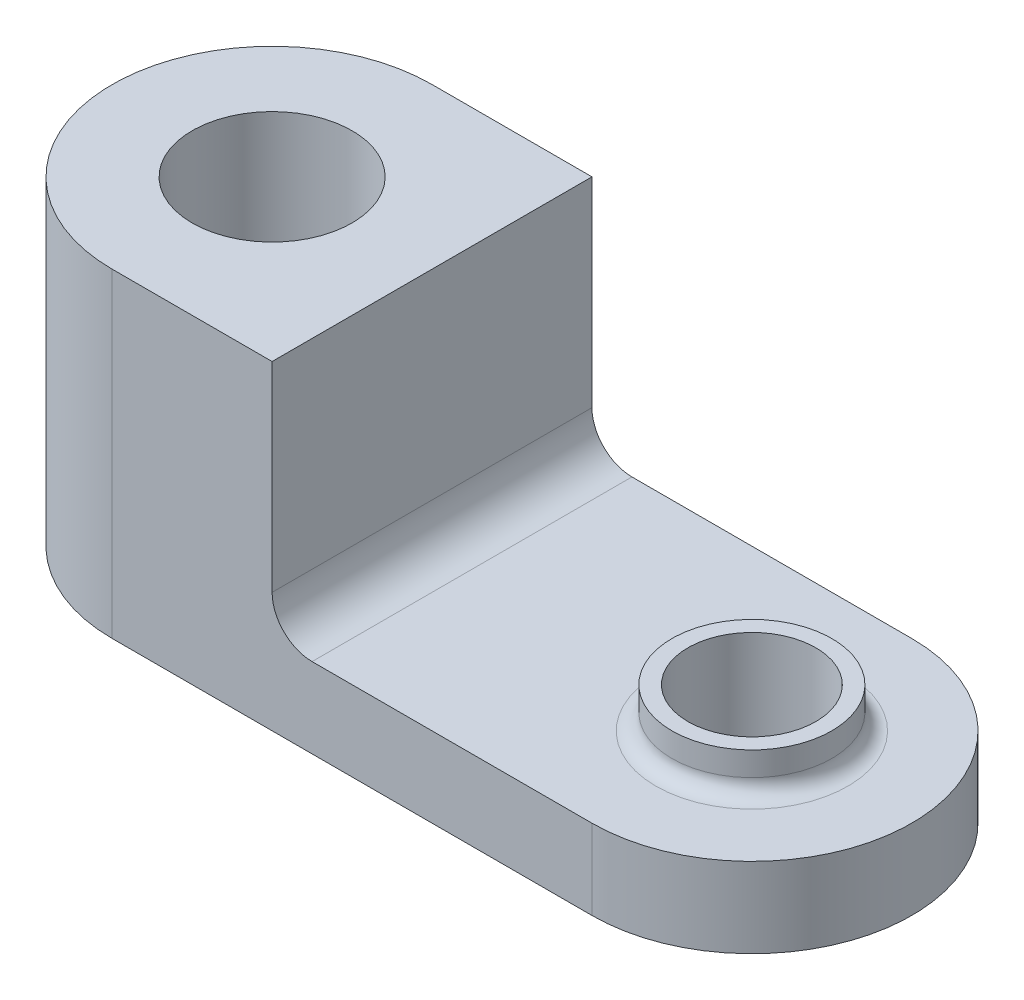
ISO-10303-21;
HEADER;
FILE_DESCRIPTION(('STEP AP214'),'2;1');
FILE_NAME('part.step','',(''),(''),'','','');
FILE_SCHEMA(('AUTOMOTIVE_DESIGN { 1 0 10303 214 1 1 1 1 }'));
ENDSEC;
DATA;
#1=APPLICATION_CONTEXT('core data for automotive mechanical design processes');
#2=APPLICATION_PROTOCOL_DEFINITION('international standard','automotive_design',2000,#1);
#3=PRODUCT_CONTEXT('',#1,'mechanical');
#4=PRODUCT('Part','Part','',(#3));
#5=PRODUCT_RELATED_PRODUCT_CATEGORY('part','',(#4));
#6=PRODUCT_DEFINITION_FORMATION('','',#4);
#7=PRODUCT_DEFINITION_CONTEXT('part definition',#1,'design');
#8=PRODUCT_DEFINITION('design','',#6,#7);
#9=PRODUCT_DEFINITION_SHAPE('','',#8);
#10=(LENGTH_UNIT() NAMED_UNIT(*) SI_UNIT(.MILLI.,.METRE.));
#11=(NAMED_UNIT(*) PLANE_ANGLE_UNIT() SI_UNIT($,.RADIAN.));
#12=(NAMED_UNIT(*) SI_UNIT($,.STERADIAN.) SOLID_ANGLE_UNIT());
#13=UNCERTAINTY_MEASURE_WITH_UNIT(LENGTH_MEASURE(1.E-05),#10,'distance_accuracy_value','');
#14=(GEOMETRIC_REPRESENTATION_CONTEXT(3) GLOBAL_UNCERTAINTY_ASSIGNED_CONTEXT((#13)) GLOBAL_UNIT_ASSIGNED_CONTEXT((#10,
#11,#12)) REPRESENTATION_CONTEXT('',''));
#15=CARTESIAN_POINT('',(0.,0.,0.));
#16=DIRECTION('',(0.,0.,1.));
#17=DIRECTION('',(1.,0.,0.));
#18=AXIS2_PLACEMENT_3D('',#15,#16,#17);
#19=CARTESIAN_POINT('',(0.,10.,20.));
#20=DIRECTION('',(0.,0.,1.));
#21=DIRECTION('',(1.,0.,0.));
#22=AXIS2_PLACEMENT_3D('',#19,#20,#21);
#23=PLANE('',#22);
#24=DIRECTION('',(-1.,0.,0.));
#25=VECTOR('',#24,1.);
#26=CARTESIAN_POINT('',(0.,0.,20.));
#27=LINE('',#26,#25);
#28=CARTESIAN_POINT('',(60.,0.,20.));
#29=VERTEX_POINT('',#28);
#30=CARTESIAN_POINT('',(0.,0.,20.));
#31=VERTEX_POINT('',#30);
#32=EDGE_CURVE('E147',#29,#31,#27,.T.);
#33=ORIENTED_EDGE('',*,*,#32,.F.);
#34=DIRECTION('',(0.,-1.,0.));
#35=VECTOR('',#34,1.);
#36=CARTESIAN_POINT('',(60.,10.,20.));
#37=LINE('',#36,#35);
#38=CARTESIAN_POINT('',(60.,10.,20.));
#39=VERTEX_POINT('',#38);
#40=EDGE_CURVE('E164',#39,#29,#37,.T.);
#41=ORIENTED_EDGE('',*,*,#40,.F.);
#42=DIRECTION('',(-1.,0.,0.));
#43=VECTOR('',#42,1.);
#44=CARTESIAN_POINT('',(0.,10.,20.));
#45=LINE('',#44,#43);
#46=CARTESIAN_POINT('',(25.,10.,20.));
#47=VERTEX_POINT('',#46);
#48=EDGE_CURVE('E150',#39,#47,#45,.T.);
#49=ORIENTED_EDGE('',*,*,#48,.T.);
#50=CARTESIAN_POINT('',(25.,15.,20.));
#51=DIRECTION('',(0.,0.,1.));
#52=DIRECTION('',(1.,0.,0.));
#53=AXIS2_PLACEMENT_3D('',#50,#51,#52);
#54=CIRCLE('',#53,5.);
#55=CARTESIAN_POINT('',(20.,15.,20.));
#56=VERTEX_POINT('',#55);
#57=EDGE_CURVE('E54',#47,#56,#54,.F.);
#58=ORIENTED_EDGE('',*,*,#57,.T.);
#59=DIRECTION('',(0.,-1.,0.));
#60=VECTOR('',#59,1.);
#61=CARTESIAN_POINT('',(20.,40.,20.));
#62=LINE('',#61,#60);
#63=CARTESIAN_POINT('',(20.,40.,20.));
#64=VERTEX_POINT('',#63);
#65=EDGE_CURVE('E138',#64,#56,#62,.T.);
#66=ORIENTED_EDGE('',*,*,#65,.F.);
#67=DIRECTION('',(-1.,0.,0.));
#68=VECTOR('',#67,1.);
#69=CARTESIAN_POINT('',(0.,40.,20.));
#70=LINE('',#69,#68);
#71=CARTESIAN_POINT('',(0.,40.,20.));
#72=VERTEX_POINT('',#71);
#73=EDGE_CURVE('E119',#64,#72,#70,.T.);
#74=ORIENTED_EDGE('',*,*,#73,.T.);
#75=DIRECTION('',(0.,-1.,0.));
#76=VECTOR('',#75,1.);
#77=CARTESIAN_POINT('',(0.,40.,20.));
#78=LINE('',#77,#76);
#79=EDGE_CURVE('E110',#72,#31,#78,.T.);
#80=ORIENTED_EDGE('',*,*,#79,.T.);
#81=EDGE_LOOP('',(#33,#41,#49,#58,#66,#74,#80));
#82=FACE_BOUND('',#81,.T.);
#83=ADVANCED_FACE('F39',(#82),#23,.T.);
#84=CARTESIAN_POINT('',(60.,10.,0.));
#85=DIRECTION('',(0.,-1.,0.));
#86=DIRECTION('',(0.,0.,-1.));
#87=AXIS2_PLACEMENT_3D('',#84,#85,#86);
#88=CYLINDRICAL_SURFACE('',#87,20.);
#89=CARTESIAN_POINT('',(60.,0.,0.));
#90=DIRECTION('',(0.,1.,0.));
#91=DIRECTION('',(0.,0.,1.));
#92=AXIS2_PLACEMENT_3D('',#89,#90,#91);
#93=CIRCLE('',#92,20.);
#94=CARTESIAN_POINT('',(60.,0.,-20.));
#95=VERTEX_POINT('',#94);
#96=EDGE_CURVE('E159',#29,#95,#93,.T.);
#97=ORIENTED_EDGE('',*,*,#96,.T.);
#98=DIRECTION('',(0.,-1.,0.));
#99=VECTOR('',#98,1.);
#100=CARTESIAN_POINT('',(60.,10.,-20.));
#101=LINE('',#100,#99);
#102=CARTESIAN_POINT('',(60.,10.,-20.));
#103=VERTEX_POINT('',#102);
#104=EDGE_CURVE('E157',#103,#95,#101,.T.);
#105=ORIENTED_EDGE('',*,*,#104,.F.);
#106=CARTESIAN_POINT('',(60.,10.,0.));
#107=DIRECTION('',(0.,1.,0.));
#108=DIRECTION('',(0.,0.,1.));
#109=AXIS2_PLACEMENT_3D('',#106,#107,#108);
#110=CIRCLE('',#109,20.);
#111=EDGE_CURVE('E152',#39,#103,#110,.T.);
#112=ORIENTED_EDGE('',*,*,#111,.F.);
#113=ORIENTED_EDGE('',*,*,#40,.T.);
#114=EDGE_LOOP('',(#97,#105,#112,#113));
#115=FACE_BOUND('',#114,.T.);
#116=ADVANCED_FACE('F187',(#115),#88,.T.);
#117=CARTESIAN_POINT('',(0.,10.,-20.));
#118=DIRECTION('',(0.,0.,-1.));
#119=DIRECTION('',(-1.,0.,0.));
#120=AXIS2_PLACEMENT_3D('',#117,#118,#119);
#121=PLANE('',#120);
#122=DIRECTION('',(1.,0.,0.));
#123=VECTOR('',#122,1.);
#124=CARTESIAN_POINT('',(0.,0.,-20.));
#125=LINE('',#124,#123);
#126=CARTESIAN_POINT('',(0.,0.,-20.));
#127=VERTEX_POINT('',#126);
#128=EDGE_CURVE('E105',#127,#95,#125,.T.);
#129=ORIENTED_EDGE('',*,*,#128,.F.);
#130=DIRECTION('',(0.,-1.,0.));
#131=VECTOR('',#130,1.);
#132=CARTESIAN_POINT('',(0.,40.,-20.));
#133=LINE('',#132,#131);
#134=CARTESIAN_POINT('',(0.,40.,-20.));
#135=VERTEX_POINT('',#134);
#136=EDGE_CURVE('E98',#135,#127,#133,.T.);
#137=ORIENTED_EDGE('',*,*,#136,.F.);
#138=DIRECTION('',(1.,0.,0.));
#139=VECTOR('',#138,1.);
#140=CARTESIAN_POINT('',(0.,40.,-20.));
#141=LINE('',#140,#139);
#142=CARTESIAN_POINT('',(20.,40.,-20.));
#143=VERTEX_POINT('',#142);
#144=EDGE_CURVE('E102',#135,#143,#141,.T.);
#145=ORIENTED_EDGE('',*,*,#144,.T.);
#146=DIRECTION('',(0.,-1.,0.));
#147=VECTOR('',#146,1.);
#148=CARTESIAN_POINT('',(20.,40.,-20.));
#149=LINE('',#148,#147);
#150=CARTESIAN_POINT('',(20.,15.,-20.));
#151=VERTEX_POINT('',#150);
#152=EDGE_CURVE('E132',#143,#151,#149,.T.);
#153=ORIENTED_EDGE('',*,*,#152,.T.);
#154=CARTESIAN_POINT('',(25.,15.,-20.));
#155=DIRECTION('',(0.,0.,-1.));
#156=DIRECTION('',(-1.,0.,0.));
#157=AXIS2_PLACEMENT_3D('',#154,#155,#156);
#158=CIRCLE('',#157,5.);
#159=CARTESIAN_POINT('',(25.,10.,-20.));
#160=VERTEX_POINT('',#159);
#161=EDGE_CURVE('E171',#151,#160,#158,.F.);
#162=ORIENTED_EDGE('',*,*,#161,.T.);
#163=DIRECTION('',(1.,0.,0.));
#164=VECTOR('',#163,1.);
#165=CARTESIAN_POINT('',(0.,10.,-20.));
#166=LINE('',#165,#164);
#167=EDGE_CURVE('E155',#160,#103,#166,.T.);
#168=ORIENTED_EDGE('',*,*,#167,.T.);
#169=ORIENTED_EDGE('',*,*,#104,.T.);
#170=EDGE_LOOP('',(#129,#137,#145,#153,#162,#168,#169));
#171=FACE_BOUND('',#170,.T.);
#172=ADVANCED_FACE('F100',(#171),#121,.T.);
#173=CARTESIAN_POINT('',(0.,10.,0.));
#174=DIRECTION('',(0.,1.,0.));
#175=DIRECTION('',(0.,0.,1.));
#176=AXIS2_PLACEMENT_3D('',#173,#174,#175);
#177=PLANE('',#176);
#178=CARTESIAN_POINT('',(60.,10.,0.));
#179=DIRECTION('',(0.,1.,0.));
#180=DIRECTION('',(0.,0.,1.));
#181=AXIS2_PLACEMENT_3D('',#178,#179,#180);
#182=CIRCLE('',#181,12.);
#183=CARTESIAN_POINT('',(60.,10.,12.));
#184=VERTEX_POINT('',#183);
#185=EDGE_CURVE('E11',#184,#184,#182,.F.);
#186=ORIENTED_EDGE('',*,*,#185,.T.);
#187=EDGE_LOOP('',(#186));
#188=FACE_BOUND('',#187,.T.);
#189=ORIENTED_EDGE('',*,*,#167,.F.);
#190=DIRECTION('',(0.,0.,1.));
#191=VECTOR('',#190,1.);
#192=CARTESIAN_POINT('',(25.,10.,20.));
#193=LINE('',#192,#191);
#194=EDGE_CURVE('E166',#160,#47,#193,.T.);
#195=ORIENTED_EDGE('',*,*,#194,.T.);
#196=ORIENTED_EDGE('',*,*,#48,.F.);
#197=ORIENTED_EDGE('',*,*,#111,.T.);
#198=EDGE_LOOP('',(#189,#195,#196,#197));
#199=FACE_BOUND('',#198,.T.);
#200=ADVANCED_FACE('F198',(#188,#199),#177,.T.);
#201=CARTESIAN_POINT('',(0.,0.,0.));
#202=DIRECTION('',(0.,1.,0.));
#203=DIRECTION('',(0.,0.,1.));
#204=AXIS2_PLACEMENT_3D('',#201,#202,#203);
#205=PLANE('',#204);
#206=ORIENTED_EDGE('',*,*,#32,.T.);
#207=CARTESIAN_POINT('',(0.,0.,0.));
#208=DIRECTION('',(0.,1.,0.));
#209=DIRECTION('',(0.,0.,1.));
#210=AXIS2_PLACEMENT_3D('',#207,#208,#209);
#211=CIRCLE('',#210,20.);
#212=EDGE_CURVE('E127',#127,#31,#211,.T.);
#213=ORIENTED_EDGE('',*,*,#212,.F.);
#214=ORIENTED_EDGE('',*,*,#128,.T.);
#215=ORIENTED_EDGE('',*,*,#96,.F.);
#216=EDGE_LOOP('',(#206,#213,#214,#215));
#217=FACE_BOUND('',#216,.T.);
#218=CARTESIAN_POINT('',(60.,0.,0.));
#219=DIRECTION('',(0.,1.,0.));
#220=DIRECTION('',(0.,0.,1.));
#221=AXIS2_PLACEMENT_3D('',#218,#219,#220);
#222=CIRCLE('',#221,8.00000000000001);
#223=CARTESIAN_POINT('',(60.,0.,8.00000000000001));
#224=VERTEX_POINT('',#223);
#225=EDGE_CURVE('E109',#224,#224,#222,.T.);
#226=ORIENTED_EDGE('',*,*,#225,.T.);
#227=EDGE_LOOP('',(#226));
#228=FACE_BOUND('',#227,.T.);
#229=CARTESIAN_POINT('',(0.,0.,0.));
#230=DIRECTION('',(0.,1.,0.));
#231=DIRECTION('',(0.,0.,1.));
#232=AXIS2_PLACEMENT_3D('',#229,#230,#231);
#233=CIRCLE('',#232,10.);
#234=CARTESIAN_POINT('',(0.,0.,10.));
#235=VERTEX_POINT('',#234);
#236=EDGE_CURVE('E133',#235,#235,#233,.T.);
#237=ORIENTED_EDGE('',*,*,#236,.T.);
#238=EDGE_LOOP('',(#237));
#239=FACE_BOUND('',#238,.T.);
#240=ADVANCED_FACE('F199',(#217,#228,#239),#205,.F.);
#241=CARTESIAN_POINT('',(60.,15.,0.));
#242=DIRECTION('',(0.,-1.,0.));
#243=DIRECTION('',(0.,0.,-1.));
#244=AXIS2_PLACEMENT_3D('',#241,#242,#243);
#245=CYLINDRICAL_SURFACE('',#244,8.00000000000001);
#246=CARTESIAN_POINT('',(60.,15.,0.));
#247=DIRECTION('',(0.,1.,0.));
#248=DIRECTION('',(0.,0.,1.));
#249=AXIS2_PLACEMENT_3D('',#246,#247,#248);
#250=CIRCLE('',#249,8.00000000000001);
#251=CARTESIAN_POINT('',(60.,15.,8.00000000000001));
#252=VERTEX_POINT('',#251);
#253=EDGE_CURVE('E141',#252,#252,#250,.T.);
#254=ORIENTED_EDGE('',*,*,#253,.T.);
#255=EDGE_LOOP('',(#254));
#256=FACE_BOUND('',#255,.T.);
#257=ORIENTED_EDGE('',*,*,#225,.F.);
#258=EDGE_LOOP('',(#257));
#259=FACE_BOUND('',#258,.T.);
#260=ADVANCED_FACE('F202',(#256,#259),#245,.F.);
#261=CARTESIAN_POINT('',(60.,15.,0.));
#262=DIRECTION('',(0.,-1.,0.));
#263=DIRECTION('',(0.,0.,-1.));
#264=AXIS2_PLACEMENT_3D('',#261,#262,#263);
#265=CYLINDRICAL_SURFACE('',#264,9.99999999999999);
#266=CARTESIAN_POINT('',(60.,12.,0.));
#267=DIRECTION('',(0.,1.,0.));
#268=DIRECTION('',(0.,0.,1.));
#269=AXIS2_PLACEMENT_3D('',#266,#267,#268);
#270=CIRCLE('',#269,9.99999999999999);
#271=CARTESIAN_POINT('',(60.,12.,9.99999999999999));
#272=VERTEX_POINT('',#271);
#273=EDGE_CURVE('E47',#272,#272,#270,.T.);
#274=ORIENTED_EDGE('',*,*,#273,.T.);
#275=EDGE_LOOP('',(#274));
#276=FACE_BOUND('',#275,.T.);
#277=CARTESIAN_POINT('',(60.,15.,0.));
#278=DIRECTION('',(0.,1.,0.));
#279=DIRECTION('',(0.,0.,1.));
#280=AXIS2_PLACEMENT_3D('',#277,#278,#279);
#281=CIRCLE('',#280,9.99999999999999);
#282=CARTESIAN_POINT('',(60.,15.,9.99999999999999));
#283=VERTEX_POINT('',#282);
#284=EDGE_CURVE('E144',#283,#283,#281,.T.);
#285=ORIENTED_EDGE('',*,*,#284,.F.);
#286=EDGE_LOOP('',(#285));
#287=FACE_BOUND('',#286,.T.);
#288=ADVANCED_FACE('F175',(#276,#287),#265,.T.);
#289=CARTESIAN_POINT('',(0.,15.,0.));
#290=DIRECTION('',(0.,1.,0.));
#291=DIRECTION('',(0.,0.,1.));
#292=AXIS2_PLACEMENT_3D('',#289,#290,#291);
#293=PLANE('',#292);
#294=ORIENTED_EDGE('',*,*,#253,.F.);
#295=EDGE_LOOP('',(#294));
#296=FACE_BOUND('',#295,.T.);
#297=ORIENTED_EDGE('',*,*,#284,.T.);
#298=EDGE_LOOP('',(#297));
#299=FACE_BOUND('',#298,.T.);
#300=ADVANCED_FACE('F212',(#296,#299),#293,.T.);
#301=CARTESIAN_POINT('',(20.,40.,0.));
#302=DIRECTION('',(1.,0.,0.));
#303=DIRECTION('',(0.,0.,-1.));
#304=AXIS2_PLACEMENT_3D('',#301,#302,#303);
#305=PLANE('',#304);
#306=ORIENTED_EDGE('',*,*,#65,.T.);
#307=DIRECTION('',(0.,0.,1.));
#308=VECTOR('',#307,1.);
#309=CARTESIAN_POINT('',(20.,15.,-20.));
#310=LINE('',#309,#308);
#311=EDGE_CURVE('E61',#56,#151,#310,.F.);
#312=ORIENTED_EDGE('',*,*,#311,.T.);
#313=ORIENTED_EDGE('',*,*,#152,.F.);
#314=DIRECTION('',(0.,0.,1.));
#315=VECTOR('',#314,1.);
#316=CARTESIAN_POINT('',(20.,40.,0.));
#317=LINE('',#316,#315);
#318=EDGE_CURVE('E123',#143,#64,#317,.T.);
#319=ORIENTED_EDGE('',*,*,#318,.T.);
#320=EDGE_LOOP('',(#306,#312,#313,#319));
#321=FACE_BOUND('',#320,.T.);
#322=ADVANCED_FACE('F215',(#321),#305,.T.);
#323=CARTESIAN_POINT('',(0.,40.,0.));
#324=DIRECTION('',(0.,-1.,0.));
#325=DIRECTION('',(0.,0.,-1.));
#326=AXIS2_PLACEMENT_3D('',#323,#324,#325);
#327=CYLINDRICAL_SURFACE('',#326,20.);
#328=ORIENTED_EDGE('',*,*,#212,.T.);
#329=ORIENTED_EDGE('',*,*,#79,.F.);
#330=CARTESIAN_POINT('',(0.,40.,0.));
#331=DIRECTION('',(0.,1.,0.));
#332=DIRECTION('',(0.,0.,1.));
#333=AXIS2_PLACEMENT_3D('',#330,#331,#332);
#334=CIRCLE('',#333,20.);
#335=EDGE_CURVE('E113',#135,#72,#334,.T.);
#336=ORIENTED_EDGE('',*,*,#335,.F.);
#337=ORIENTED_EDGE('',*,*,#136,.T.);
#338=EDGE_LOOP('',(#328,#329,#336,#337));
#339=FACE_BOUND('',#338,.T.);
#340=ADVANCED_FACE('F114',(#339),#327,.T.);
#341=CARTESIAN_POINT('',(0.,40.,0.));
#342=DIRECTION('',(0.,-1.,0.));
#343=DIRECTION('',(0.,0.,-1.));
#344=AXIS2_PLACEMENT_3D('',#341,#342,#343);
#345=CYLINDRICAL_SURFACE('',#344,10.);
#346=CARTESIAN_POINT('',(0.,40.,0.));
#347=DIRECTION('',(0.,1.,0.));
#348=DIRECTION('',(0.,0.,1.));
#349=AXIS2_PLACEMENT_3D('',#346,#347,#348);
#350=CIRCLE('',#349,10.);
#351=CARTESIAN_POINT('',(0.,40.,10.));
#352=VERTEX_POINT('',#351);
#353=EDGE_CURVE('E124',#352,#352,#350,.T.);
#354=ORIENTED_EDGE('',*,*,#353,.T.);
#355=EDGE_LOOP('',(#354));
#356=FACE_BOUND('',#355,.T.);
#357=ORIENTED_EDGE('',*,*,#236,.F.);
#358=EDGE_LOOP('',(#357));
#359=FACE_BOUND('',#358,.T.);
#360=ADVANCED_FACE('F217',(#356,#359),#345,.F.);
#361=CARTESIAN_POINT('',(0.,40.,0.));
#362=DIRECTION('',(0.,1.,0.));
#363=DIRECTION('',(0.,0.,1.));
#364=AXIS2_PLACEMENT_3D('',#361,#362,#363);
#365=PLANE('',#364);
#366=ORIENTED_EDGE('',*,*,#353,.F.);
#367=EDGE_LOOP('',(#366));
#368=FACE_BOUND('',#367,.T.);
#369=ORIENTED_EDGE('',*,*,#144,.F.);
#370=ORIENTED_EDGE('',*,*,#335,.T.);
#371=ORIENTED_EDGE('',*,*,#73,.F.);
#372=ORIENTED_EDGE('',*,*,#318,.F.);
#373=EDGE_LOOP('',(#369,#370,#371,#372));
#374=FACE_BOUND('',#373,.T.);
#375=ADVANCED_FACE('F121',(#368,#374),#365,.T.);
#376=CARTESIAN_POINT('',(25.,15.,0.));
#377=DIRECTION('',(0.,0.,-1.));
#378=DIRECTION('',(-1.,0.,0.));
#379=AXIS2_PLACEMENT_3D('',#376,#377,#378);
#380=CYLINDRICAL_SURFACE('',#379,5.);
#381=ORIENTED_EDGE('',*,*,#161,.F.);
#382=ORIENTED_EDGE('',*,*,#311,.F.);
#383=ORIENTED_EDGE('',*,*,#57,.F.);
#384=ORIENTED_EDGE('',*,*,#194,.F.);
#385=EDGE_LOOP('',(#381,#382,#383,#384));
#386=FACE_BOUND('',#385,.T.);
#387=ADVANCED_FACE('F179',(#386),#380,.F.);
#388=CARTESIAN_POINT('',(60.,12.,0.));
#389=DIRECTION('',(0.,1.,0.));
#390=DIRECTION('',(0.,0.,1.));
#391=AXIS2_PLACEMENT_3D('',#388,#389,#390);
#392=TOROIDAL_SURFACE('',#391,12.,2.);
#393=ORIENTED_EDGE('',*,*,#185,.F.);
#394=EDGE_LOOP('',(#393));
#395=FACE_BOUND('',#394,.T.);
#396=ORIENTED_EDGE('',*,*,#273,.F.);
#397=EDGE_LOOP('',(#396));
#398=FACE_BOUND('',#397,.T.);
#399=ADVANCED_FACE('F41',(#395,#398),#392,.F.);
#400=CLOSED_SHELL('',(#83,#116,#172,#200,#240,#260,#288,#300,#322,#340,#360,#375,#387,#399));
#401=MANIFOLD_SOLID_BREP('B2',#400);
#402=ADVANCED_BREP_SHAPE_REPRESENTATION('',(#18,#401),#14);
#403=SHAPE_DEFINITION_REPRESENTATION(#9,#402);
ENDSEC;
END-ISO-10303-21;
